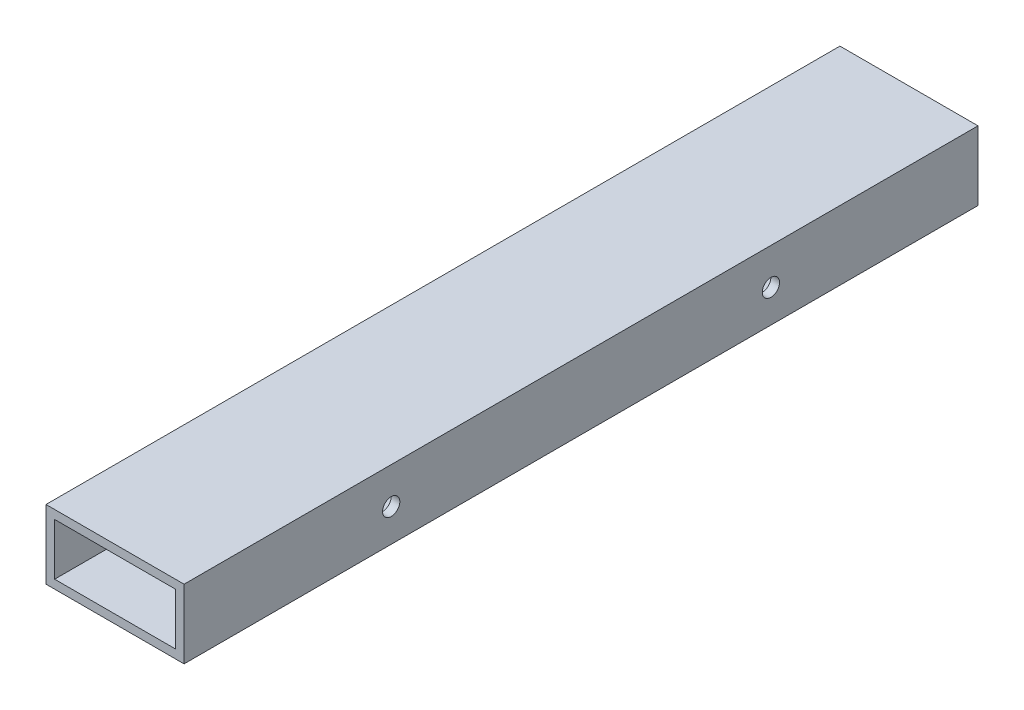
ISO-10303-21;
HEADER;
FILE_DESCRIPTION(('STEP AP214'),'2;1');
FILE_NAME('part.step','',(''),(''),'','','');
FILE_SCHEMA(('AUTOMOTIVE_DESIGN { 1 0 10303 214 1 1 1 1 }'));
ENDSEC;
DATA;
#1=APPLICATION_CONTEXT('core data for automotive mechanical design processes');
#2=APPLICATION_PROTOCOL_DEFINITION('international standard','automotive_design',2000,#1);
#3=PRODUCT_CONTEXT('',#1,'mechanical');
#4=PRODUCT('Part','Part','',(#3));
#5=PRODUCT_RELATED_PRODUCT_CATEGORY('part','',(#4));
#6=PRODUCT_DEFINITION_FORMATION('','',#4);
#7=PRODUCT_DEFINITION_CONTEXT('part definition',#1,'design');
#8=PRODUCT_DEFINITION('design','',#6,#7);
#9=PRODUCT_DEFINITION_SHAPE('','',#8);
#10=(LENGTH_UNIT() NAMED_UNIT(*) SI_UNIT(.MILLI.,.METRE.));
#11=(NAMED_UNIT(*) PLANE_ANGLE_UNIT() SI_UNIT($,.RADIAN.));
#12=(NAMED_UNIT(*) SI_UNIT($,.STERADIAN.) SOLID_ANGLE_UNIT());
#13=UNCERTAINTY_MEASURE_WITH_UNIT(LENGTH_MEASURE(1.E-05),#10,'distance_accuracy_value','');
#14=(GEOMETRIC_REPRESENTATION_CONTEXT(3) GLOBAL_UNCERTAINTY_ASSIGNED_CONTEXT((#13)) GLOBAL_UNIT_ASSIGNED_CONTEXT((#10,
#11,#12)) REPRESENTATION_CONTEXT('',''));
#15=CARTESIAN_POINT('',(0.,0.,0.));
#16=DIRECTION('',(0.,0.,1.));
#17=DIRECTION('',(1.,0.,0.));
#18=AXIS2_PLACEMENT_3D('',#15,#16,#17);
#19=CARTESIAN_POINT('',(0.,0.,292.1));
#20=DIRECTION('',(0.,0.,-1.));
#21=DIRECTION('',(-1.,0.,0.));
#22=AXIS2_PLACEMENT_3D('',#19,#20,#21);
#23=PLANE('',#22);
#24=DIRECTION('',(0.,-1.,0.));
#25=VECTOR('',#24,1.);
#26=CARTESIAN_POINT('',(0.,0.,292.1));
#27=LINE('',#26,#25);
#28=CARTESIAN_POINT('',(0.,25.4,292.1));
#29=VERTEX_POINT('',#28);
#30=CARTESIAN_POINT('',(0.,0.,292.1));
#31=VERTEX_POINT('',#30);
#32=EDGE_CURVE('E163',#29,#31,#27,.T.);
#33=ORIENTED_EDGE('',*,*,#32,.T.);
#34=DIRECTION('',(1.,0.,0.));
#35=VECTOR('',#34,1.);
#36=CARTESIAN_POINT('',(0.,0.,292.1));
#37=LINE('',#36,#35);
#38=CARTESIAN_POINT('',(50.8,0.,292.1));
#39=VERTEX_POINT('',#38);
#40=EDGE_CURVE('E167',#31,#39,#37,.T.);
#41=ORIENTED_EDGE('',*,*,#40,.T.);
#42=DIRECTION('',(0.,1.,0.));
#43=VECTOR('',#42,1.);
#44=CARTESIAN_POINT('',(50.8,0.,292.1));
#45=LINE('',#44,#43);
#46=CARTESIAN_POINT('',(50.8,25.4,292.1));
#47=VERTEX_POINT('',#46);
#48=EDGE_CURVE('E171',#39,#47,#45,.T.);
#49=ORIENTED_EDGE('',*,*,#48,.T.);
#50=DIRECTION('',(-1.,0.,0.));
#51=VECTOR('',#50,1.);
#52=CARTESIAN_POINT('',(0.,25.4,292.1));
#53=LINE('',#52,#51);
#54=EDGE_CURVE('E174',#47,#29,#53,.T.);
#55=ORIENTED_EDGE('',*,*,#54,.T.);
#56=EDGE_LOOP('',(#33,#41,#49,#55));
#57=FACE_BOUND('',#56,.T.);
#58=DIRECTION('',(0.,-1.,0.));
#59=VECTOR('',#58,1.);
#60=CARTESIAN_POINT('',(3.175,3.175,292.1));
#61=LINE('',#60,#59);
#62=CARTESIAN_POINT('',(3.175,22.225,292.1));
#63=VERTEX_POINT('',#62);
#64=CARTESIAN_POINT('',(3.175,3.175,292.1));
#65=VERTEX_POINT('',#64);
#66=EDGE_CURVE('E113',#63,#65,#61,.T.);
#67=ORIENTED_EDGE('',*,*,#66,.F.);
#68=DIRECTION('',(-1.,0.,0.));
#69=VECTOR('',#68,1.);
#70=CARTESIAN_POINT('',(3.175,22.225,292.1));
#71=LINE('',#70,#69);
#72=CARTESIAN_POINT('',(47.625,22.225,292.1));
#73=VERTEX_POINT('',#72);
#74=EDGE_CURVE('E139',#73,#63,#71,.T.);
#75=ORIENTED_EDGE('',*,*,#74,.F.);
#76=DIRECTION('',(0.,1.,0.));
#77=VECTOR('',#76,1.);
#78=CARTESIAN_POINT('',(47.625,3.175,292.1));
#79=LINE('',#78,#77);
#80=CARTESIAN_POINT('',(47.625,3.175,292.1));
#81=VERTEX_POINT('',#80);
#82=EDGE_CURVE('E135',#81,#73,#79,.T.);
#83=ORIENTED_EDGE('',*,*,#82,.F.);
#84=DIRECTION('',(1.,0.,0.));
#85=VECTOR('',#84,1.);
#86=CARTESIAN_POINT('',(3.175,3.175,292.1));
#87=LINE('',#86,#85);
#88=EDGE_CURVE('E122',#65,#81,#87,.T.);
#89=ORIENTED_EDGE('',*,*,#88,.F.);
#90=EDGE_LOOP('',(#67,#75,#83,#89));
#91=FACE_BOUND('',#90,.T.);
#92=ADVANCED_FACE('F45',(#57,#91),#23,.F.);
#93=CARTESIAN_POINT('',(0.,0.,0.));
#94=DIRECTION('',(0.,0.,-1.));
#95=DIRECTION('',(-1.,0.,0.));
#96=AXIS2_PLACEMENT_3D('',#93,#94,#95);
#97=PLANE('',#96);
#98=DIRECTION('',(0.,-1.,0.));
#99=VECTOR('',#98,1.);
#100=CARTESIAN_POINT('',(0.,0.,0.));
#101=LINE('',#100,#99);
#102=CARTESIAN_POINT('',(0.,25.4,0.));
#103=VERTEX_POINT('',#102);
#104=CARTESIAN_POINT('',(0.,0.,0.));
#105=VERTEX_POINT('',#104);
#106=EDGE_CURVE('E131',#103,#105,#101,.T.);
#107=ORIENTED_EDGE('',*,*,#106,.F.);
#108=DIRECTION('',(-1.,0.,0.));
#109=VECTOR('',#108,1.);
#110=CARTESIAN_POINT('',(0.,25.4,0.));
#111=LINE('',#110,#109);
#112=CARTESIAN_POINT('',(50.8,25.4,0.));
#113=VERTEX_POINT('',#112);
#114=EDGE_CURVE('E168',#113,#103,#111,.T.);
#115=ORIENTED_EDGE('',*,*,#114,.F.);
#116=DIRECTION('',(0.,1.,0.));
#117=VECTOR('',#116,1.);
#118=CARTESIAN_POINT('',(50.8,0.,0.));
#119=LINE('',#118,#117);
#120=CARTESIAN_POINT('',(50.8,0.,0.));
#121=VERTEX_POINT('',#120);
#122=EDGE_CURVE('E184',#121,#113,#119,.T.);
#123=ORIENTED_EDGE('',*,*,#122,.F.);
#124=DIRECTION('',(1.,0.,0.));
#125=VECTOR('',#124,1.);
#126=CARTESIAN_POINT('',(0.,0.,0.));
#127=LINE('',#126,#125);
#128=EDGE_CURVE('E181',#105,#121,#127,.T.);
#129=ORIENTED_EDGE('',*,*,#128,.F.);
#130=EDGE_LOOP('',(#107,#115,#123,#129));
#131=FACE_BOUND('',#130,.T.);
#132=DIRECTION('',(-1.,0.,0.));
#133=VECTOR('',#132,1.);
#134=CARTESIAN_POINT('',(3.175,22.225,0.));
#135=LINE('',#134,#133);
#136=CARTESIAN_POINT('',(47.625,22.225,0.));
#137=VERTEX_POINT('',#136);
#138=CARTESIAN_POINT('',(3.175,22.225,0.));
#139=VERTEX_POINT('',#138);
#140=EDGE_CURVE('E123',#137,#139,#135,.T.);
#141=ORIENTED_EDGE('',*,*,#140,.T.);
#142=DIRECTION('',(0.,-1.,0.));
#143=VECTOR('',#142,1.);
#144=CARTESIAN_POINT('',(3.175,3.175,0.));
#145=LINE('',#144,#143);
#146=CARTESIAN_POINT('',(3.175,3.175,0.));
#147=VERTEX_POINT('',#146);
#148=EDGE_CURVE('E71',#139,#147,#145,.T.);
#149=ORIENTED_EDGE('',*,*,#148,.T.);
#150=DIRECTION('',(1.,0.,0.));
#151=VECTOR('',#150,1.);
#152=CARTESIAN_POINT('',(3.175,3.175,0.));
#153=LINE('',#152,#151);
#154=CARTESIAN_POINT('',(47.625,3.175,0.));
#155=VERTEX_POINT('',#154);
#156=EDGE_CURVE('E129',#147,#155,#153,.T.);
#157=ORIENTED_EDGE('',*,*,#156,.T.);
#158=DIRECTION('',(0.,1.,0.));
#159=VECTOR('',#158,1.);
#160=CARTESIAN_POINT('',(47.625,3.175,0.));
#161=LINE('',#160,#159);
#162=EDGE_CURVE('E150',#155,#137,#161,.T.);
#163=ORIENTED_EDGE('',*,*,#162,.T.);
#164=EDGE_LOOP('',(#141,#149,#157,#163));
#165=FACE_BOUND('',#164,.T.);
#166=ADVANCED_FACE('F244',(#131,#165),#97,.T.);
#167=CARTESIAN_POINT('',(0.,0.,292.1));
#168=DIRECTION('',(1.,0.,0.));
#169=DIRECTION('',(0.,0.,-1.));
#170=AXIS2_PLACEMENT_3D('',#167,#168,#169);
#171=PLANE('',#170);
#172=CARTESIAN_POINT('',(0.,12.0267583984575,215.9));
#173=DIRECTION('',(1.,0.,0.));
#174=DIRECTION('',(0.,0.,-1.));
#175=AXIS2_PLACEMENT_3D('',#172,#173,#174);
#176=CIRCLE('',#175,3.17499999999997);
#177=CARTESIAN_POINT('',(0.,12.0267583984575,212.725));
#178=VERTEX_POINT('',#177);
#179=EDGE_CURVE('E202',#178,#178,#176,.T.);
#180=ORIENTED_EDGE('',*,*,#179,.T.);
#181=EDGE_LOOP('',(#180));
#182=FACE_BOUND('',#181,.T.);
#183=CARTESIAN_POINT('',(0.,12.0267583984575,76.2));
#184=DIRECTION('',(1.,0.,0.));
#185=DIRECTION('',(0.,0.,-1.));
#186=AXIS2_PLACEMENT_3D('',#183,#184,#185);
#187=CIRCLE('',#186,3.175);
#188=CARTESIAN_POINT('',(0.,12.0267583984575,73.025));
#189=VERTEX_POINT('',#188);
#190=EDGE_CURVE('E222',#189,#189,#187,.T.);
#191=ORIENTED_EDGE('',*,*,#190,.T.);
#192=EDGE_LOOP('',(#191));
#193=FACE_BOUND('',#192,.T.);
#194=ORIENTED_EDGE('',*,*,#106,.T.);
#195=DIRECTION('',(0.,0.,-1.));
#196=VECTOR('',#195,1.);
#197=CARTESIAN_POINT('',(0.,0.,292.1));
#198=LINE('',#197,#196);
#199=EDGE_CURVE('E11',#31,#105,#198,.T.);
#200=ORIENTED_EDGE('',*,*,#199,.F.);
#201=ORIENTED_EDGE('',*,*,#32,.F.);
#202=DIRECTION('',(0.,0.,-1.));
#203=VECTOR('',#202,1.);
#204=CARTESIAN_POINT('',(0.,25.4,292.1));
#205=LINE('',#204,#203);
#206=EDGE_CURVE('E177',#29,#103,#205,.T.);
#207=ORIENTED_EDGE('',*,*,#206,.T.);
#208=EDGE_LOOP('',(#194,#200,#201,#207));
#209=FACE_BOUND('',#208,.T.);
#210=ADVANCED_FACE('F47',(#182,#193,#209),#171,.F.);
#211=CARTESIAN_POINT('',(0.,0.,292.1));
#212=DIRECTION('',(0.,1.,0.));
#213=DIRECTION('',(0.,0.,1.));
#214=AXIS2_PLACEMENT_3D('',#211,#212,#213);
#215=PLANE('',#214);
#216=ORIENTED_EDGE('',*,*,#128,.T.);
#217=DIRECTION('',(0.,0.,-1.));
#218=VECTOR('',#217,1.);
#219=CARTESIAN_POINT('',(50.8,0.,292.1));
#220=LINE('',#219,#218);
#221=EDGE_CURVE('E55',#39,#121,#220,.T.);
#222=ORIENTED_EDGE('',*,*,#221,.F.);
#223=ORIENTED_EDGE('',*,*,#40,.F.);
#224=ORIENTED_EDGE('',*,*,#199,.T.);
#225=EDGE_LOOP('',(#216,#222,#223,#224));
#226=FACE_BOUND('',#225,.T.);
#227=ADVANCED_FACE('F272',(#226),#215,.F.);
#228=CARTESIAN_POINT('',(50.8,0.,292.1));
#229=DIRECTION('',(-1.,0.,0.));
#230=DIRECTION('',(0.,0.,1.));
#231=AXIS2_PLACEMENT_3D('',#228,#229,#230);
#232=PLANE('',#231);
#233=CARTESIAN_POINT('',(50.8,12.0267583984575,215.9));
#234=DIRECTION('',(1.,0.,0.));
#235=DIRECTION('',(0.,0.,-1.));
#236=AXIS2_PLACEMENT_3D('',#233,#234,#235);
#237=CIRCLE('',#236,3.17499999999997);
#238=CARTESIAN_POINT('',(50.8,12.0267583984575,212.725));
#239=VERTEX_POINT('',#238);
#240=EDGE_CURVE('E210',#239,#239,#237,.T.);
#241=ORIENTED_EDGE('',*,*,#240,.F.);
#242=EDGE_LOOP('',(#241));
#243=FACE_BOUND('',#242,.T.);
#244=CARTESIAN_POINT('',(50.8,12.0267583984575,76.2));
#245=DIRECTION('',(1.,0.,0.));
#246=DIRECTION('',(0.,0.,-1.));
#247=AXIS2_PLACEMENT_3D('',#244,#245,#246);
#248=CIRCLE('',#247,3.175);
#249=CARTESIAN_POINT('',(50.8,12.0267583984575,73.025));
#250=VERTEX_POINT('',#249);
#251=EDGE_CURVE('E216',#250,#250,#248,.T.);
#252=ORIENTED_EDGE('',*,*,#251,.F.);
#253=EDGE_LOOP('',(#252));
#254=FACE_BOUND('',#253,.T.);
#255=ORIENTED_EDGE('',*,*,#122,.T.);
#256=DIRECTION('',(0.,0.,-1.));
#257=VECTOR('',#256,1.);
#258=CARTESIAN_POINT('',(50.8,25.4,292.1));
#259=LINE('',#258,#257);
#260=EDGE_CURVE('E192',#47,#113,#259,.T.);
#261=ORIENTED_EDGE('',*,*,#260,.F.);
#262=ORIENTED_EDGE('',*,*,#48,.F.);
#263=ORIENTED_EDGE('',*,*,#221,.T.);
#264=EDGE_LOOP('',(#255,#261,#262,#263));
#265=FACE_BOUND('',#264,.T.);
#266=ADVANCED_FACE('F269',(#243,#254,#265),#232,.F.);
#267=CARTESIAN_POINT('',(0.,25.4,292.1));
#268=DIRECTION('',(0.,-1.,0.));
#269=DIRECTION('',(0.,0.,-1.));
#270=AXIS2_PLACEMENT_3D('',#267,#268,#269);
#271=PLANE('',#270);
#272=ORIENTED_EDGE('',*,*,#114,.T.);
#273=ORIENTED_EDGE('',*,*,#206,.F.);
#274=ORIENTED_EDGE('',*,*,#54,.F.);
#275=ORIENTED_EDGE('',*,*,#260,.T.);
#276=EDGE_LOOP('',(#272,#273,#274,#275));
#277=FACE_BOUND('',#276,.T.);
#278=ADVANCED_FACE('F266',(#277),#271,.F.);
#279=CARTESIAN_POINT('',(3.175,3.175,292.1));
#280=DIRECTION('',(1.,0.,0.));
#281=DIRECTION('',(0.,0.,-1.));
#282=AXIS2_PLACEMENT_3D('',#279,#280,#281);
#283=PLANE('',#282);
#284=CARTESIAN_POINT('',(3.175,12.0267583984575,215.9));
#285=DIRECTION('',(1.,0.,0.));
#286=DIRECTION('',(0.,0.,-1.));
#287=AXIS2_PLACEMENT_3D('',#284,#285,#286);
#288=CIRCLE('',#287,3.17499999999997);
#289=CARTESIAN_POINT('',(3.175,12.0267583984575,212.725));
#290=VERTEX_POINT('',#289);
#291=EDGE_CURVE('E147',#290,#290,#288,.T.);
#292=ORIENTED_EDGE('',*,*,#291,.F.);
#293=EDGE_LOOP('',(#292));
#294=FACE_BOUND('',#293,.T.);
#295=CARTESIAN_POINT('',(3.175,12.0267583984575,76.2));
#296=DIRECTION('',(1.,0.,0.));
#297=DIRECTION('',(0.,0.,-1.));
#298=AXIS2_PLACEMENT_3D('',#295,#296,#297);
#299=CIRCLE('',#298,3.175);
#300=CARTESIAN_POINT('',(3.175,12.0267583984575,73.025));
#301=VERTEX_POINT('',#300);
#302=EDGE_CURVE('E201',#301,#301,#299,.T.);
#303=ORIENTED_EDGE('',*,*,#302,.F.);
#304=EDGE_LOOP('',(#303));
#305=FACE_BOUND('',#304,.T.);
#306=ORIENTED_EDGE('',*,*,#148,.F.);
#307=DIRECTION('',(0.,0.,-1.));
#308=VECTOR('',#307,1.);
#309=CARTESIAN_POINT('',(3.175,22.225,292.1));
#310=LINE('',#309,#308);
#311=EDGE_CURVE('E117',#63,#139,#310,.T.);
#312=ORIENTED_EDGE('',*,*,#311,.F.);
#313=ORIENTED_EDGE('',*,*,#66,.T.);
#314=DIRECTION('',(0.,0.,-1.));
#315=VECTOR('',#314,1.);
#316=CARTESIAN_POINT('',(3.175,3.175,292.1));
#317=LINE('',#316,#315);
#318=EDGE_CURVE('E116',#65,#147,#317,.T.);
#319=ORIENTED_EDGE('',*,*,#318,.T.);
#320=EDGE_LOOP('',(#306,#312,#313,#319));
#321=FACE_BOUND('',#320,.T.);
#322=ADVANCED_FACE('F115',(#294,#305,#321),#283,.T.);
#323=CARTESIAN_POINT('',(3.175,3.175,292.1));
#324=DIRECTION('',(0.,1.,0.));
#325=DIRECTION('',(0.,0.,1.));
#326=AXIS2_PLACEMENT_3D('',#323,#324,#325);
#327=PLANE('',#326);
#328=ORIENTED_EDGE('',*,*,#156,.F.);
#329=ORIENTED_EDGE('',*,*,#318,.F.);
#330=ORIENTED_EDGE('',*,*,#88,.T.);
#331=DIRECTION('',(0.,0.,-1.));
#332=VECTOR('',#331,1.);
#333=CARTESIAN_POINT('',(47.625,3.175,292.1));
#334=LINE('',#333,#332);
#335=EDGE_CURVE('E132',#81,#155,#334,.T.);
#336=ORIENTED_EDGE('',*,*,#335,.T.);
#337=EDGE_LOOP('',(#328,#329,#330,#336));
#338=FACE_BOUND('',#337,.T.);
#339=ADVANCED_FACE('F126',(#338),#327,.T.);
#340=CARTESIAN_POINT('',(47.625,3.175,292.1));
#341=DIRECTION('',(-1.,0.,0.));
#342=DIRECTION('',(0.,0.,1.));
#343=AXIS2_PLACEMENT_3D('',#340,#341,#342);
#344=PLANE('',#343);
#345=CARTESIAN_POINT('',(47.625,12.0267583984575,215.9));
#346=DIRECTION('',(-1.,0.,0.));
#347=DIRECTION('',(0.,0.,1.));
#348=AXIS2_PLACEMENT_3D('',#345,#346,#347);
#349=CIRCLE('',#348,3.17499999999997);
#350=CARTESIAN_POINT('',(47.625,12.0267583984575,219.075));
#351=VERTEX_POINT('',#350);
#352=EDGE_CURVE('E49',#351,#351,#349,.T.);
#353=ORIENTED_EDGE('',*,*,#352,.F.);
#354=EDGE_LOOP('',(#353));
#355=FACE_BOUND('',#354,.T.);
#356=CARTESIAN_POINT('',(47.625,12.0267583984575,76.2));
#357=DIRECTION('',(-1.,0.,0.));
#358=DIRECTION('',(0.,0.,1.));
#359=AXIS2_PLACEMENT_3D('',#356,#357,#358);
#360=CIRCLE('',#359,3.175);
#361=CARTESIAN_POINT('',(47.625,12.0267583984575,79.375));
#362=VERTEX_POINT('',#361);
#363=EDGE_CURVE('E198',#362,#362,#360,.T.);
#364=ORIENTED_EDGE('',*,*,#363,.F.);
#365=EDGE_LOOP('',(#364));
#366=FACE_BOUND('',#365,.T.);
#367=ORIENTED_EDGE('',*,*,#162,.F.);
#368=ORIENTED_EDGE('',*,*,#335,.F.);
#369=ORIENTED_EDGE('',*,*,#82,.T.);
#370=DIRECTION('',(0.,0.,-1.));
#371=VECTOR('',#370,1.);
#372=CARTESIAN_POINT('',(47.625,22.225,292.1));
#373=LINE('',#372,#371);
#374=EDGE_CURVE('E63',#73,#137,#373,.T.);
#375=ORIENTED_EDGE('',*,*,#374,.T.);
#376=EDGE_LOOP('',(#367,#368,#369,#375));
#377=FACE_BOUND('',#376,.T.);
#378=ADVANCED_FACE('F236',(#355,#366,#377),#344,.T.);
#379=CARTESIAN_POINT('',(3.175,22.225,292.1));
#380=DIRECTION('',(0.,-1.,0.));
#381=DIRECTION('',(0.,0.,-1.));
#382=AXIS2_PLACEMENT_3D('',#379,#380,#381);
#383=PLANE('',#382);
#384=ORIENTED_EDGE('',*,*,#140,.F.);
#385=ORIENTED_EDGE('',*,*,#374,.F.);
#386=ORIENTED_EDGE('',*,*,#74,.T.);
#387=ORIENTED_EDGE('',*,*,#311,.T.);
#388=EDGE_LOOP('',(#384,#385,#386,#387));
#389=FACE_BOUND('',#388,.T.);
#390=ADVANCED_FACE('F239',(#389),#383,.T.);
#391=CARTESIAN_POINT('',(0.,12.0267583984575,76.2));
#392=DIRECTION('',(1.,0.,0.));
#393=DIRECTION('',(0.,0.,-1.));
#394=AXIS2_PLACEMENT_3D('',#391,#392,#393);
#395=CYLINDRICAL_SURFACE('',#394,3.175);
#396=ORIENTED_EDGE('',*,*,#363,.T.);
#397=EDGE_LOOP('',(#396));
#398=FACE_BOUND('',#397,.T.);
#399=ORIENTED_EDGE('',*,*,#251,.T.);
#400=EDGE_LOOP('',(#399));
#401=FACE_BOUND('',#400,.T.);
#402=ADVANCED_FACE('F246',(#398,#401),#395,.F.);
#403=CARTESIAN_POINT('',(0.,12.0267583984575,215.9));
#404=DIRECTION('',(1.,0.,0.));
#405=DIRECTION('',(0.,0.,-1.));
#406=AXIS2_PLACEMENT_3D('',#403,#404,#405);
#407=CYLINDRICAL_SURFACE('',#406,3.17499999999997);
#408=ORIENTED_EDGE('',*,*,#352,.T.);
#409=EDGE_LOOP('',(#408));
#410=FACE_BOUND('',#409,.T.);
#411=ORIENTED_EDGE('',*,*,#240,.T.);
#412=EDGE_LOOP('',(#411));
#413=FACE_BOUND('',#412,.T.);
#414=ADVANCED_FACE('F233',(#410,#413),#407,.F.);
#415=ORIENTED_EDGE('',*,*,#302,.T.);
#416=EDGE_LOOP('',(#415));
#417=FACE_BOUND('',#416,.T.);
#418=ORIENTED_EDGE('',*,*,#190,.F.);
#419=EDGE_LOOP('',(#418));
#420=FACE_BOUND('',#419,.T.);
#421=ADVANCED_FACE('F254',(#417,#420),#395,.F.);
#422=ORIENTED_EDGE('',*,*,#291,.T.);
#423=EDGE_LOOP('',(#422));
#424=FACE_BOUND('',#423,.T.);
#425=ORIENTED_EDGE('',*,*,#179,.F.);
#426=EDGE_LOOP('',(#425));
#427=FACE_BOUND('',#426,.T.);
#428=ADVANCED_FACE('F296',(#424,#427),#407,.F.);
#429=CLOSED_SHELL('',(#92,#166,#210,#227,#266,#278,#322,#339,#378,#390,#402,#414,#421,#428));
#430=MANIFOLD_SOLID_BREP('B2',#429);
#431=ADVANCED_BREP_SHAPE_REPRESENTATION('',(#18,#430),#14);
#432=SHAPE_DEFINITION_REPRESENTATION(#9,#431);
ENDSEC;
END-ISO-10303-21;
